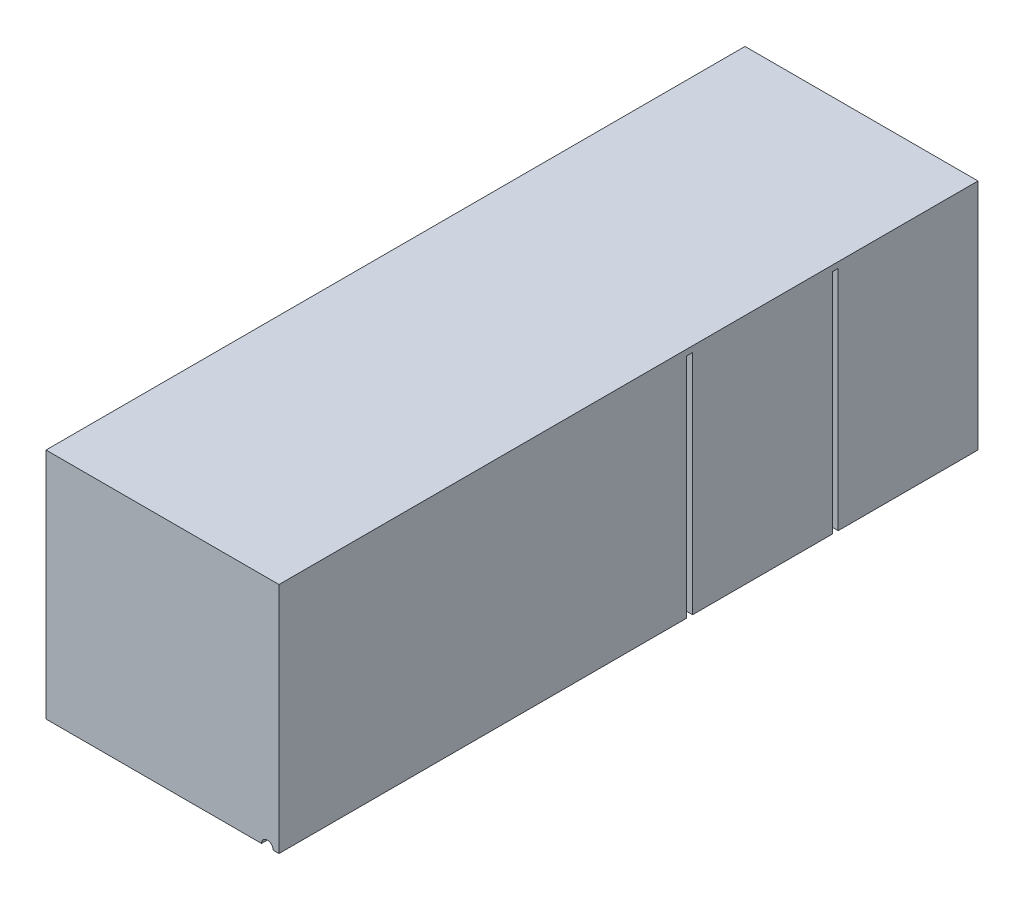
ISO-10303-21;
HEADER;
FILE_DESCRIPTION(('STEP AP214'),'2;1');
FILE_NAME('part.step','',(''),(''),'','','');
FILE_SCHEMA(('AUTOMOTIVE_DESIGN { 1 0 10303 214 1 1 1 1 }'));
ENDSEC;
DATA;
#1=APPLICATION_CONTEXT('core data for automotive mechanical design processes');
#2=APPLICATION_PROTOCOL_DEFINITION('international standard','automotive_design',2000,#1);
#3=PRODUCT_CONTEXT('',#1,'mechanical');
#4=PRODUCT('Part','Part','',(#3));
#5=PRODUCT_RELATED_PRODUCT_CATEGORY('part','',(#4));
#6=PRODUCT_DEFINITION_FORMATION('','',#4);
#7=PRODUCT_DEFINITION_CONTEXT('part definition',#1,'design');
#8=PRODUCT_DEFINITION('design','',#6,#7);
#9=PRODUCT_DEFINITION_SHAPE('','',#8);
#10=(LENGTH_UNIT() NAMED_UNIT(*) SI_UNIT(.MILLI.,.METRE.));
#11=(NAMED_UNIT(*) PLANE_ANGLE_UNIT() SI_UNIT($,.RADIAN.));
#12=(NAMED_UNIT(*) SI_UNIT($,.STERADIAN.) SOLID_ANGLE_UNIT());
#13=UNCERTAINTY_MEASURE_WITH_UNIT(LENGTH_MEASURE(1.E-05),#10,'distance_accuracy_value','');
#14=(GEOMETRIC_REPRESENTATION_CONTEXT(3) GLOBAL_UNCERTAINTY_ASSIGNED_CONTEXT((#13)) GLOBAL_UNIT_ASSIGNED_CONTEXT((#10,
#11,#12)) REPRESENTATION_CONTEXT('',''));
#15=CARTESIAN_POINT('',(0.,0.,0.));
#16=DIRECTION('',(0.,0.,1.));
#17=DIRECTION('',(1.,0.,0.));
#18=AXIS2_PLACEMENT_3D('',#15,#16,#17);
#19=CARTESIAN_POINT('',(148.,29.8959813156576,127.860636733485));
#20=DIRECTION('',(0.,1.,0.));
#21=DIRECTION('',(-1.,0.,0.));
#22=AXIS2_PLACEMENT_3D('',#19,#20,#21);
#23=PLANE('',#22);
#24=DIRECTION('',(0.,0.,-1.));
#25=VECTOR('',#24,1.);
#26=CARTESIAN_POINT('',(148.,29.8959813156576,127.860636733485));
#27=LINE('',#26,#25);
#28=CARTESIAN_POINT('',(148.,29.8959813156576,56.8606367334853));
#29=VERTEX_POINT('',#28);
#30=CARTESIAN_POINT('',(148.,29.8959813156576,32.8606367334853));
#31=VERTEX_POINT('',#30);
#32=EDGE_CURVE('E234',#29,#31,#27,.T.);
#33=ORIENTED_EDGE('',*,*,#32,.F.);
#34=DIRECTION('',(1.,0.,0.));
#35=VECTOR('',#34,1.);
#36=CARTESIAN_POINT('',(148.,29.8959813156576,56.8606367334853));
#37=LINE('',#36,#35);
#38=CARTESIAN_POINT('',(108.,29.8959813156576,56.8606367334853));
#39=VERTEX_POINT('',#38);
#40=EDGE_CURVE('E163',#39,#29,#37,.T.);
#41=ORIENTED_EDGE('',*,*,#40,.F.);
#42=DIRECTION('',(0.,0.,-1.));
#43=VECTOR('',#42,1.);
#44=CARTESIAN_POINT('',(108.,29.8959813156576,127.860636733485));
#45=LINE('',#44,#43);
#46=CARTESIAN_POINT('',(108.,29.8959813156576,32.8606367334853));
#47=VERTEX_POINT('',#46);
#48=EDGE_CURVE('E237',#39,#47,#45,.T.);
#49=ORIENTED_EDGE('',*,*,#48,.T.);
#50=DIRECTION('',(-1.,0.,0.));
#51=VECTOR('',#50,1.);
#52=CARTESIAN_POINT('',(148.,29.8959813156576,32.8606367334853));
#53=LINE('',#52,#51);
#54=EDGE_CURVE('E187',#31,#47,#53,.T.);
#55=ORIENTED_EDGE('',*,*,#54,.F.);
#56=EDGE_LOOP('',(#33,#41,#49,#55));
#57=FACE_BOUND('',#56,.T.);
#58=ADVANCED_FACE('F42',(#57),#23,.F.);
#59=CARTESIAN_POINT('',(108.,29.8959813156576,127.860636733485));
#60=VERTEX_POINT('',#59);
#61=CARTESIAN_POINT('',(108.,29.8959813156576,57.8606367334853));
#62=VERTEX_POINT('',#61);
#63=EDGE_CURVE('E235',#60,#62,#45,.T.);
#64=ORIENTED_EDGE('',*,*,#63,.T.);
#65=DIRECTION('',(-1.,0.,0.));
#66=VECTOR('',#65,1.);
#67=CARTESIAN_POINT('',(148.,29.8959813156576,57.8606367334853));
#68=LINE('',#67,#66);
#69=CARTESIAN_POINT('',(145.,29.8959813156576,57.8606367334853));
#70=VERTEX_POINT('',#69);
#71=EDGE_CURVE('E190',#70,#62,#68,.T.);
#72=ORIENTED_EDGE('',*,*,#71,.F.);
#73=DIRECTION('',(0.,0.,1.));
#74=VECTOR('',#73,1.);
#75=CARTESIAN_POINT('',(145.,29.8959813156576,57.8606367334853));
#76=LINE('',#75,#74);
#77=CARTESIAN_POINT('',(145.,29.8959813156576,127.860636733485));
#78=VERTEX_POINT('',#77);
#79=EDGE_CURVE('E206',#70,#78,#76,.T.);
#80=ORIENTED_EDGE('',*,*,#79,.T.);
#81=DIRECTION('',(1.,0.,0.));
#82=VECTOR('',#81,1.);
#83=CARTESIAN_POINT('',(148.,29.8959813156576,127.860636733485));
#84=LINE('',#83,#82);
#85=EDGE_CURVE('E219',#60,#78,#84,.T.);
#86=ORIENTED_EDGE('',*,*,#85,.F.);
#87=EDGE_LOOP('',(#64,#72,#80,#86));
#88=FACE_BOUND('',#87,.T.);
#89=ADVANCED_FACE('F283',(#88),#23,.F.);
#90=CARTESIAN_POINT('',(148.,29.8959813156576,31.8606367334853));
#91=VERTEX_POINT('',#90);
#92=CARTESIAN_POINT('',(148.,29.8959813156576,7.86063673348532));
#93=VERTEX_POINT('',#92);
#94=EDGE_CURVE('E222',#91,#93,#27,.T.);
#95=ORIENTED_EDGE('',*,*,#94,.F.);
#96=DIRECTION('',(1.,0.,0.));
#97=VECTOR('',#96,1.);
#98=CARTESIAN_POINT('',(148.,29.8959813156576,31.8606367334853));
#99=LINE('',#98,#97);
#100=CARTESIAN_POINT('',(108.,29.8959813156576,31.8606367334853));
#101=VERTEX_POINT('',#100);
#102=EDGE_CURVE('E185',#101,#91,#99,.T.);
#103=ORIENTED_EDGE('',*,*,#102,.F.);
#104=CARTESIAN_POINT('',(108.,29.8959813156576,7.86063673348532));
#105=VERTEX_POINT('',#104);
#106=EDGE_CURVE('E233',#101,#105,#45,.T.);
#107=ORIENTED_EDGE('',*,*,#106,.T.);
#108=DIRECTION('',(1.,0.,0.));
#109=VECTOR('',#108,1.);
#110=CARTESIAN_POINT('',(148.,29.8959813156576,7.86063673348532));
#111=LINE('',#110,#109);
#112=EDGE_CURVE('E214',#105,#93,#111,.T.);
#113=ORIENTED_EDGE('',*,*,#112,.T.);
#114=EDGE_LOOP('',(#95,#103,#107,#113));
#115=FACE_BOUND('',#114,.T.);
#116=ADVANCED_FACE('F254',(#115),#23,.F.);
#117=CARTESIAN_POINT('',(148.,69.8959813156576,127.860636733485));
#118=DIRECTION('',(-1.,0.,0.));
#119=DIRECTION('',(0.,0.,1.));
#120=AXIS2_PLACEMENT_3D('',#117,#118,#119);
#121=PLANE('',#120);
#122=DIRECTION('',(0.,0.,1.));
#123=VECTOR('',#122,1.);
#124=CARTESIAN_POINT('',(148.,68.8959813156576,57.8606367334853));
#125=LINE('',#124,#123);
#126=CARTESIAN_POINT('',(148.,68.8959813156576,56.8606367334853));
#127=VERTEX_POINT('',#126);
#128=CARTESIAN_POINT('',(148.,68.8959813156576,57.8606367334853));
#129=VERTEX_POINT('',#128);
#130=EDGE_CURVE('E154',#127,#129,#125,.T.);
#131=ORIENTED_EDGE('',*,*,#130,.F.);
#132=DIRECTION('',(0.,-1.,0.));
#133=VECTOR('',#132,1.);
#134=CARTESIAN_POINT('',(148.,68.8959813156576,56.8606367334853));
#135=LINE('',#134,#133);
#136=EDGE_CURVE('E204',#127,#29,#135,.T.);
#137=ORIENTED_EDGE('',*,*,#136,.T.);
#138=ORIENTED_EDGE('',*,*,#32,.T.);
#139=DIRECTION('',(0.,-1.,0.));
#140=VECTOR('',#139,1.);
#141=CARTESIAN_POINT('',(148.,68.8959813156576,32.8606367334853));
#142=LINE('',#141,#140);
#143=CARTESIAN_POINT('',(148.,68.8959813156576,32.8606367334853));
#144=VERTEX_POINT('',#143);
#145=EDGE_CURVE('E57',#144,#31,#142,.T.);
#146=ORIENTED_EDGE('',*,*,#145,.F.);
#147=DIRECTION('',(0.,0.,1.));
#148=VECTOR('',#147,1.);
#149=CARTESIAN_POINT('',(148.,68.8959813156576,32.8606367334853));
#150=LINE('',#149,#148);
#151=CARTESIAN_POINT('',(148.,68.8959813156576,31.8606367334853));
#152=VERTEX_POINT('',#151);
#153=EDGE_CURVE('E188',#152,#144,#150,.T.);
#154=ORIENTED_EDGE('',*,*,#153,.F.);
#155=DIRECTION('',(0.,-1.,0.));
#156=VECTOR('',#155,1.);
#157=CARTESIAN_POINT('',(148.,68.8959813156576,31.8606367334853));
#158=LINE('',#157,#156);
#159=EDGE_CURVE('E182',#152,#91,#158,.T.);
#160=ORIENTED_EDGE('',*,*,#159,.T.);
#161=ORIENTED_EDGE('',*,*,#94,.T.);
#162=DIRECTION('',(0.,1.,0.));
#163=VECTOR('',#162,1.);
#164=CARTESIAN_POINT('',(148.,69.8959813156576,7.86063673348532));
#165=LINE('',#164,#163);
#166=CARTESIAN_POINT('',(148.,69.8959813156576,7.86063673348532));
#167=VERTEX_POINT('',#166);
#168=EDGE_CURVE('E209',#93,#167,#165,.T.);
#169=ORIENTED_EDGE('',*,*,#168,.T.);
#170=DIRECTION('',(0.,0.,-1.));
#171=VECTOR('',#170,1.);
#172=CARTESIAN_POINT('',(148.,69.8959813156576,127.860636733485));
#173=LINE('',#172,#171);
#174=CARTESIAN_POINT('',(148.,69.8959813156576,127.860636733485));
#175=VERTEX_POINT('',#174);
#176=EDGE_CURVE('E11',#175,#167,#173,.T.);
#177=ORIENTED_EDGE('',*,*,#176,.F.);
#178=DIRECTION('',(0.,1.,0.));
#179=VECTOR('',#178,1.);
#180=CARTESIAN_POINT('',(148.,69.8959813156576,127.860636733485));
#181=LINE('',#180,#179);
#182=CARTESIAN_POINT('',(148.,29.8959813156576,127.860636733485));
#183=VERTEX_POINT('',#182);
#184=EDGE_CURVE('E210',#183,#175,#181,.T.);
#185=ORIENTED_EDGE('',*,*,#184,.F.);
#186=CARTESIAN_POINT('',(148.,29.8959813156576,57.8606367334853));
#187=VERTEX_POINT('',#186);
#188=EDGE_CURVE('E168',#183,#187,#27,.T.);
#189=ORIENTED_EDGE('',*,*,#188,.T.);
#190=DIRECTION('',(0.,-1.,0.));
#191=VECTOR('',#190,1.);
#192=CARTESIAN_POINT('',(148.,68.8959813156576,57.8606367334853));
#193=LINE('',#192,#191);
#194=EDGE_CURVE('E147',#129,#187,#193,.T.);
#195=ORIENTED_EDGE('',*,*,#194,.F.);
#196=EDGE_LOOP('',(#131,#137,#138,#146,#154,#160,#161,#169,#177,#185,#189,#195));
#197=FACE_BOUND('',#196,.T.);
#198=ADVANCED_FACE('F44',(#197),#121,.F.);
#199=CARTESIAN_POINT('',(148.,69.8959813156576,127.860636733485));
#200=DIRECTION('',(0.,-1.,0.));
#201=DIRECTION('',(0.,0.,-1.));
#202=AXIS2_PLACEMENT_3D('',#199,#200,#201);
#203=PLANE('',#202);
#204=DIRECTION('',(-1.,0.,0.));
#205=VECTOR('',#204,1.);
#206=CARTESIAN_POINT('',(148.,69.8959813156576,7.86063673348532));
#207=LINE('',#206,#205);
#208=CARTESIAN_POINT('',(108.,69.8959813156576,7.86063673348532));
#209=VERTEX_POINT('',#208);
#210=EDGE_CURVE('E225',#167,#209,#207,.T.);
#211=ORIENTED_EDGE('',*,*,#210,.T.);
#212=DIRECTION('',(0.,0.,-1.));
#213=VECTOR('',#212,1.);
#214=CARTESIAN_POINT('',(108.,69.8959813156576,127.860636733485));
#215=LINE('',#214,#213);
#216=CARTESIAN_POINT('',(108.,69.8959813156576,127.860636733485));
#217=VERTEX_POINT('',#216);
#218=EDGE_CURVE('E50',#217,#209,#215,.T.);
#219=ORIENTED_EDGE('',*,*,#218,.F.);
#220=DIRECTION('',(-1.,0.,0.));
#221=VECTOR('',#220,1.);
#222=CARTESIAN_POINT('',(148.,69.8959813156576,127.860636733485));
#223=LINE('',#222,#221);
#224=EDGE_CURVE('E213',#175,#217,#223,.T.);
#225=ORIENTED_EDGE('',*,*,#224,.F.);
#226=ORIENTED_EDGE('',*,*,#176,.T.);
#227=EDGE_LOOP('',(#211,#219,#225,#226));
#228=FACE_BOUND('',#227,.T.);
#229=ADVANCED_FACE('F301',(#228),#203,.F.);
#230=CARTESIAN_POINT('',(108.,69.8959813156576,127.860636733485));
#231=DIRECTION('',(1.,0.,0.));
#232=DIRECTION('',(0.,0.,-1.));
#233=AXIS2_PLACEMENT_3D('',#230,#231,#232);
#234=PLANE('',#233);
#235=ORIENTED_EDGE('',*,*,#48,.F.);
#236=DIRECTION('',(0.,-1.,0.));
#237=VECTOR('',#236,1.);
#238=CARTESIAN_POINT('',(108.,68.8959813156576,56.8606367334853));
#239=LINE('',#238,#237);
#240=CARTESIAN_POINT('',(108.,68.8959813156576,56.8606367334853));
#241=VERTEX_POINT('',#240);
#242=EDGE_CURVE('E170',#241,#39,#239,.T.);
#243=ORIENTED_EDGE('',*,*,#242,.F.);
#244=DIRECTION('',(0.,0.,-1.));
#245=VECTOR('',#244,1.);
#246=CARTESIAN_POINT('',(108.,68.8959813156576,57.8606367334853));
#247=LINE('',#246,#245);
#248=CARTESIAN_POINT('',(108.,68.8959813156576,57.8606367334853));
#249=VERTEX_POINT('',#248);
#250=EDGE_CURVE('E153',#249,#241,#247,.T.);
#251=ORIENTED_EDGE('',*,*,#250,.F.);
#252=DIRECTION('',(0.,-1.,0.));
#253=VECTOR('',#252,1.);
#254=CARTESIAN_POINT('',(108.,68.8959813156576,57.8606367334853));
#255=LINE('',#254,#253);
#256=EDGE_CURVE('E150',#249,#62,#255,.T.);
#257=ORIENTED_EDGE('',*,*,#256,.T.);
#258=ORIENTED_EDGE('',*,*,#63,.F.);
#259=DIRECTION('',(0.,-1.,0.));
#260=VECTOR('',#259,1.);
#261=CARTESIAN_POINT('',(108.,69.8959813156576,127.860636733485));
#262=LINE('',#261,#260);
#263=EDGE_CURVE('E216',#217,#60,#262,.T.);
#264=ORIENTED_EDGE('',*,*,#263,.F.);
#265=ORIENTED_EDGE('',*,*,#218,.T.);
#266=DIRECTION('',(0.,-1.,0.));
#267=VECTOR('',#266,1.);
#268=CARTESIAN_POINT('',(108.,69.8959813156576,7.86063673348532));
#269=LINE('',#268,#267);
#270=EDGE_CURVE('E227',#209,#105,#269,.T.);
#271=ORIENTED_EDGE('',*,*,#270,.T.);
#272=ORIENTED_EDGE('',*,*,#106,.F.);
#273=DIRECTION('',(0.,-1.,0.));
#274=VECTOR('',#273,1.);
#275=CARTESIAN_POINT('',(108.,68.8959813156576,31.8606367334853));
#276=LINE('',#275,#274);
#277=CARTESIAN_POINT('',(108.,68.8959813156576,31.8606367334853));
#278=VERTEX_POINT('',#277);
#279=EDGE_CURVE('E180',#278,#101,#276,.T.);
#280=ORIENTED_EDGE('',*,*,#279,.F.);
#281=DIRECTION('',(0.,0.,-1.));
#282=VECTOR('',#281,1.);
#283=CARTESIAN_POINT('',(108.,68.8959813156576,32.8606367334853));
#284=LINE('',#283,#282);
#285=CARTESIAN_POINT('',(108.,68.8959813156576,32.8606367334853));
#286=VERTEX_POINT('',#285);
#287=EDGE_CURVE('E193',#286,#278,#284,.T.);
#288=ORIENTED_EDGE('',*,*,#287,.F.);
#289=DIRECTION('',(0.,-1.,0.));
#290=VECTOR('',#289,1.);
#291=CARTESIAN_POINT('',(108.,68.8959813156576,32.8606367334853));
#292=LINE('',#291,#290);
#293=EDGE_CURVE('E177',#286,#47,#292,.T.);
#294=ORIENTED_EDGE('',*,*,#293,.T.);
#295=EDGE_LOOP('',(#235,#243,#251,#257,#258,#264,#265,#271,#272,#280,#288,#294));
#296=FACE_BOUND('',#295,.T.);
#297=ADVANCED_FACE('F244',(#296),#234,.F.);
#298=DIRECTION('',(0.,0.,1.));
#299=VECTOR('',#298,1.);
#300=CARTESIAN_POINT('',(147.,29.8959813156576,57.8606367334853));
#301=LINE('',#300,#299);
#302=CARTESIAN_POINT('',(147.,29.8959813156576,127.860636733485));
#303=VERTEX_POINT('',#302);
#304=CARTESIAN_POINT('',(147.,29.8959813156576,57.8606367334853));
#305=VERTEX_POINT('',#304);
#306=EDGE_CURVE('E65',#303,#305,#301,.F.);
#307=ORIENTED_EDGE('',*,*,#306,.T.);
#308=EDGE_CURVE('E312',#187,#305,#68,.T.);
#309=ORIENTED_EDGE('',*,*,#308,.F.);
#310=ORIENTED_EDGE('',*,*,#188,.F.);
#311=EDGE_CURVE('E218',#303,#183,#84,.T.);
#312=ORIENTED_EDGE('',*,*,#311,.F.);
#313=EDGE_LOOP('',(#307,#309,#310,#312));
#314=FACE_BOUND('',#313,.T.);
#315=ADVANCED_FACE('F285',(#314),#23,.F.);
#316=CARTESIAN_POINT('',(0.,0.,127.860636733485));
#317=DIRECTION('',(0.,0.,-1.));
#318=DIRECTION('',(-1.,0.,0.));
#319=AXIS2_PLACEMENT_3D('',#316,#317,#318);
#320=PLANE('',#319);
#321=ORIENTED_EDGE('',*,*,#85,.T.);
#322=CARTESIAN_POINT('',(146.,29.8959813156576,127.860636733485));
#323=DIRECTION('',(0.,0.,1.));
#324=DIRECTION('',(1.,0.,0.));
#325=AXIS2_PLACEMENT_3D('',#322,#323,#324);
#326=CIRCLE('',#325,0.999999999999998);
#327=EDGE_CURVE('E202',#303,#78,#326,.T.);
#328=ORIENTED_EDGE('',*,*,#327,.F.);
#329=ORIENTED_EDGE('',*,*,#311,.T.);
#330=ORIENTED_EDGE('',*,*,#184,.T.);
#331=ORIENTED_EDGE('',*,*,#224,.T.);
#332=ORIENTED_EDGE('',*,*,#263,.T.);
#333=EDGE_LOOP('',(#321,#328,#329,#330,#331,#332));
#334=FACE_BOUND('',#333,.T.);
#335=ADVANCED_FACE('F293',(#334),#320,.F.);
#336=CARTESIAN_POINT('',(0.,0.,7.86063673348532));
#337=DIRECTION('',(0.,0.,-1.));
#338=DIRECTION('',(-1.,0.,0.));
#339=AXIS2_PLACEMENT_3D('',#336,#337,#338);
#340=PLANE('',#339);
#341=ORIENTED_EDGE('',*,*,#168,.F.);
#342=ORIENTED_EDGE('',*,*,#112,.F.);
#343=ORIENTED_EDGE('',*,*,#270,.F.);
#344=ORIENTED_EDGE('',*,*,#210,.F.);
#345=EDGE_LOOP('',(#341,#342,#343,#344));
#346=FACE_BOUND('',#345,.T.);
#347=ADVANCED_FACE('F251',(#346),#340,.T.);
#348=CARTESIAN_POINT('',(146.,29.8959813156576,57.8606367334853));
#349=DIRECTION('',(0.,0.,1.));
#350=DIRECTION('',(1.,0.,0.));
#351=AXIS2_PLACEMENT_3D('',#348,#349,#350);
#352=CYLINDRICAL_SURFACE('',#351,0.999999999999998);
#353=CARTESIAN_POINT('',(146.,29.8959813156576,57.8606367334853));
#354=DIRECTION('',(0.,0.,1.));
#355=DIRECTION('',(1.,0.,0.));
#356=AXIS2_PLACEMENT_3D('',#353,#354,#355);
#357=CIRCLE('',#356,0.999999999999998);
#358=EDGE_CURVE('E200',#305,#70,#357,.T.);
#359=ORIENTED_EDGE('',*,*,#358,.F.);
#360=ORIENTED_EDGE('',*,*,#306,.F.);
#361=ORIENTED_EDGE('',*,*,#327,.T.);
#362=ORIENTED_EDGE('',*,*,#79,.F.);
#363=EDGE_LOOP('',(#359,#360,#361,#362));
#364=FACE_BOUND('',#363,.T.);
#365=ADVANCED_FACE('F323',(#364),#352,.F.);
#366=CARTESIAN_POINT('',(148.,68.8959813156576,57.8606367334853));
#367=DIRECTION('',(0.,0.,1.));
#368=DIRECTION('',(1.,0.,0.));
#369=AXIS2_PLACEMENT_3D('',#366,#367,#368);
#370=PLANE('',#369);
#371=ORIENTED_EDGE('',*,*,#71,.T.);
#372=ORIENTED_EDGE('',*,*,#256,.F.);
#373=DIRECTION('',(-1.,0.,0.));
#374=VECTOR('',#373,1.);
#375=CARTESIAN_POINT('',(148.,68.8959813156576,57.8606367334853));
#376=LINE('',#375,#374);
#377=EDGE_CURVE('E143',#129,#249,#376,.T.);
#378=ORIENTED_EDGE('',*,*,#377,.F.);
#379=ORIENTED_EDGE('',*,*,#194,.T.);
#380=ORIENTED_EDGE('',*,*,#308,.T.);
#381=ORIENTED_EDGE('',*,*,#358,.T.);
#382=EDGE_LOOP('',(#371,#372,#378,#379,#380,#381));
#383=FACE_BOUND('',#382,.T.);
#384=ADVANCED_FACE('F145',(#383),#370,.F.);
#385=CARTESIAN_POINT('',(148.,68.8959813156576,56.8606367334853));
#386=DIRECTION('',(0.,0.,-1.));
#387=DIRECTION('',(-1.,0.,0.));
#388=AXIS2_PLACEMENT_3D('',#385,#386,#387);
#389=PLANE('',#388);
#390=ORIENTED_EDGE('',*,*,#40,.T.);
#391=ORIENTED_EDGE('',*,*,#136,.F.);
#392=DIRECTION('',(1.,0.,0.));
#393=VECTOR('',#392,1.);
#394=CARTESIAN_POINT('',(148.,68.8959813156576,56.8606367334853));
#395=LINE('',#394,#393);
#396=EDGE_CURVE('E160',#241,#127,#395,.T.);
#397=ORIENTED_EDGE('',*,*,#396,.F.);
#398=ORIENTED_EDGE('',*,*,#242,.T.);
#399=EDGE_LOOP('',(#390,#391,#397,#398));
#400=FACE_BOUND('',#399,.T.);
#401=ADVANCED_FACE('F279',(#400),#389,.F.);
#402=CARTESIAN_POINT('',(0.,68.8959813156576,0.));
#403=DIRECTION('',(0.,1.,0.));
#404=DIRECTION('',(-1.,0.,0.));
#405=AXIS2_PLACEMENT_3D('',#402,#403,#404);
#406=PLANE('',#405);
#407=ORIENTED_EDGE('',*,*,#130,.T.);
#408=ORIENTED_EDGE('',*,*,#377,.T.);
#409=ORIENTED_EDGE('',*,*,#250,.T.);
#410=ORIENTED_EDGE('',*,*,#396,.T.);
#411=EDGE_LOOP('',(#407,#408,#409,#410));
#412=FACE_BOUND('',#411,.T.);
#413=ADVANCED_FACE('F158',(#412),#406,.F.);
#414=CARTESIAN_POINT('',(148.,68.8959813156576,31.8606367334853));
#415=DIRECTION('',(0.,0.,-1.));
#416=DIRECTION('',(-1.,0.,0.));
#417=AXIS2_PLACEMENT_3D('',#414,#415,#416);
#418=PLANE('',#417);
#419=ORIENTED_EDGE('',*,*,#102,.T.);
#420=ORIENTED_EDGE('',*,*,#159,.F.);
#421=DIRECTION('',(1.,0.,0.));
#422=VECTOR('',#421,1.);
#423=CARTESIAN_POINT('',(148.,68.8959813156576,31.8606367334853));
#424=LINE('',#423,#422);
#425=EDGE_CURVE('E176',#278,#152,#424,.T.);
#426=ORIENTED_EDGE('',*,*,#425,.F.);
#427=ORIENTED_EDGE('',*,*,#279,.T.);
#428=EDGE_LOOP('',(#419,#420,#426,#427));
#429=FACE_BOUND('',#428,.T.);
#430=ADVANCED_FACE('F271',(#429),#418,.F.);
#431=CARTESIAN_POINT('',(148.,68.8959813156576,32.8606367334853));
#432=DIRECTION('',(0.,0.,1.));
#433=DIRECTION('',(1.,0.,0.));
#434=AXIS2_PLACEMENT_3D('',#431,#432,#433);
#435=PLANE('',#434);
#436=ORIENTED_EDGE('',*,*,#54,.T.);
#437=ORIENTED_EDGE('',*,*,#293,.F.);
#438=DIRECTION('',(-1.,0.,0.));
#439=VECTOR('',#438,1.);
#440=CARTESIAN_POINT('',(148.,68.8959813156576,32.8606367334853));
#441=LINE('',#440,#439);
#442=EDGE_CURVE('E195',#144,#286,#441,.T.);
#443=ORIENTED_EDGE('',*,*,#442,.F.);
#444=ORIENTED_EDGE('',*,*,#145,.T.);
#445=EDGE_LOOP('',(#436,#437,#443,#444));
#446=FACE_BOUND('',#445,.T.);
#447=ADVANCED_FACE('F264',(#446),#435,.F.);
#448=CARTESIAN_POINT('',(0.,68.8959813156576,0.));
#449=DIRECTION('',(0.,1.,0.));
#450=DIRECTION('',(-1.,0.,0.));
#451=AXIS2_PLACEMENT_3D('',#448,#449,#450);
#452=PLANE('',#451);
#453=ORIENTED_EDGE('',*,*,#153,.T.);
#454=ORIENTED_EDGE('',*,*,#442,.T.);
#455=ORIENTED_EDGE('',*,*,#287,.T.);
#456=ORIENTED_EDGE('',*,*,#425,.T.);
#457=EDGE_LOOP('',(#453,#454,#455,#456));
#458=FACE_BOUND('',#457,.T.);
#459=ADVANCED_FACE('F266',(#458),#452,.F.);
#460=CLOSED_SHELL('',(#58,#89,#116,#198,#229,#297,#315,#335,#347,#365,#384,#401,#413,#430,#447,#459));
#461=MANIFOLD_SOLID_BREP('B2',#460);
#462=ADVANCED_BREP_SHAPE_REPRESENTATION('',(#18,#461),#14);
#463=SHAPE_DEFINITION_REPRESENTATION(#9,#462);
ENDSEC;
END-ISO-10303-21;
